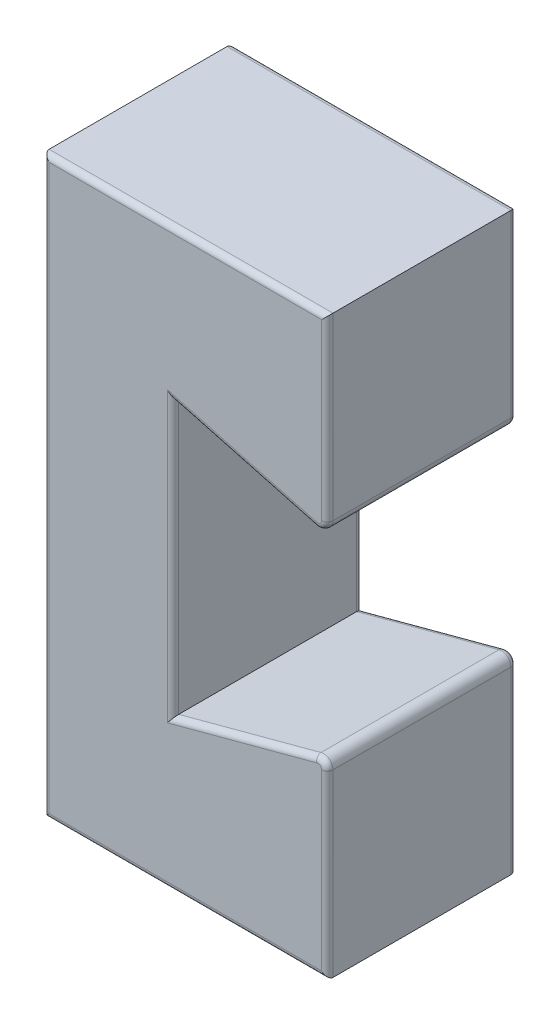
ISO-10303-21;
HEADER;
FILE_DESCRIPTION(('STEP AP214'),'2;1');
FILE_NAME('part.step','',(''),(''),'','','');
FILE_SCHEMA(('AUTOMOTIVE_DESIGN { 1 0 10303 214 1 1 1 1 }'));
ENDSEC;
DATA;
#1=APPLICATION_CONTEXT('core data for automotive mechanical design processes');
#2=APPLICATION_PROTOCOL_DEFINITION('international standard','automotive_design',2000,#1);
#3=PRODUCT_CONTEXT('',#1,'mechanical');
#4=PRODUCT('Part','Part','',(#3));
#5=PRODUCT_RELATED_PRODUCT_CATEGORY('part','',(#4));
#6=PRODUCT_DEFINITION_FORMATION('','',#4);
#7=PRODUCT_DEFINITION_CONTEXT('part definition',#1,'design');
#8=PRODUCT_DEFINITION('design','',#6,#7);
#9=PRODUCT_DEFINITION_SHAPE('','',#8);
#10=(LENGTH_UNIT() NAMED_UNIT(*) SI_UNIT(.MILLI.,.METRE.));
#11=(NAMED_UNIT(*) PLANE_ANGLE_UNIT() SI_UNIT($,.RADIAN.));
#12=(NAMED_UNIT(*) SI_UNIT($,.STERADIAN.) SOLID_ANGLE_UNIT());
#13=UNCERTAINTY_MEASURE_WITH_UNIT(LENGTH_MEASURE(1.E-05),#10,'distance_accuracy_value','');
#14=(GEOMETRIC_REPRESENTATION_CONTEXT(3) GLOBAL_UNCERTAINTY_ASSIGNED_CONTEXT((#13)) GLOBAL_UNIT_ASSIGNED_CONTEXT((#10,
#11,#12)) REPRESENTATION_CONTEXT('',''));
#15=CARTESIAN_POINT('',(0.,0.,0.));
#16=DIRECTION('',(0.,0.,1.));
#17=DIRECTION('',(1.,0.,0.));
#18=AXIS2_PLACEMENT_3D('',#15,#16,#17);
#19=CARTESIAN_POINT('',(0.,0.,10.));
#20=DIRECTION('',(0.,0.,-1.));
#21=DIRECTION('',(-1.,0.,0.));
#22=AXIS2_PLACEMENT_3D('',#19,#20,#21);
#23=PLANE('',#22);
#24=CARTESIAN_POINT('',(14.5,20.9016126864206,10.));
#25=DIRECTION('',(0.,0.,-1.));
#26=DIRECTION('',(-1.,0.,0.));
#27=AXIS2_PLACEMENT_3D('',#24,#25,#26);
#28=CIRCLE('',#27,0.2);
#29=CARTESIAN_POINT('',(14.7,20.9016126864206,10.));
#30=VERTEX_POINT('',#29);
#31=CARTESIAN_POINT('',(14.4482361909795,20.7084275211628,10.));
#32=VERTEX_POINT('',#31);
#33=EDGE_CURVE('E326',#30,#32,#28,.T.);
#34=ORIENTED_EDGE('',*,*,#33,.F.);
#35=DIRECTION('',(0.,1.,0.));
#36=VECTOR('',#35,1.);
#37=CARTESIAN_POINT('',(14.7,0.,10.));
#38=LINE('',#37,#36);
#39=CARTESIAN_POINT('',(14.7,30.1,10.));
#40=VERTEX_POINT('',#39);
#41=EDGE_CURVE('E281',#30,#40,#38,.T.);
#42=ORIENTED_EDGE('',*,*,#41,.T.);
#43=DIRECTION('',(-1.,0.,0.));
#44=VECTOR('',#43,1.);
#45=CARTESIAN_POINT('',(0.,30.1,10.));
#46=LINE('',#45,#44);
#47=CARTESIAN_POINT('',(0.3,30.1,10.));
#48=VERTEX_POINT('',#47);
#49=EDGE_CURVE('E283',#40,#48,#46,.T.);
#50=ORIENTED_EDGE('',*,*,#49,.T.);
#51=DIRECTION('',(0.,-1.,0.));
#52=VECTOR('',#51,1.);
#53=CARTESIAN_POINT('',(0.3,0.,10.));
#54=LINE('',#53,#52);
#55=CARTESIAN_POINT('',(0.3,0.3,10.));
#56=VERTEX_POINT('',#55);
#57=EDGE_CURVE('E269',#48,#56,#54,.T.);
#58=ORIENTED_EDGE('',*,*,#57,.T.);
#59=DIRECTION('',(1.,0.,0.));
#60=VECTOR('',#59,1.);
#61=CARTESIAN_POINT('',(0.,0.3,10.));
#62=LINE('',#61,#60);
#63=CARTESIAN_POINT('',(14.7,0.3,10.));
#64=VERTEX_POINT('',#63);
#65=EDGE_CURVE('E271',#56,#64,#62,.T.);
#66=ORIENTED_EDGE('',*,*,#65,.T.);
#67=DIRECTION('',(0.,1.,0.));
#68=VECTOR('',#67,1.);
#69=CARTESIAN_POINT('',(14.7,0.,10.));
#70=LINE('',#69,#68);
#71=CARTESIAN_POINT('',(14.7,9.4983873135794,10.));
#72=VERTEX_POINT('',#71);
#73=EDGE_CURVE('E210',#64,#72,#70,.T.);
#74=ORIENTED_EDGE('',*,*,#73,.T.);
#75=CARTESIAN_POINT('',(14.5,9.4983873135794,10.));
#76=DIRECTION('',(0.,0.,-1.));
#77=DIRECTION('',(-1.,0.,0.));
#78=AXIS2_PLACEMENT_3D('',#75,#76,#77);
#79=CIRCLE('',#78,0.2);
#80=CARTESIAN_POINT('',(14.4482361909795,9.69157247883722,10.));
#81=VERTEX_POINT('',#80);
#82=EDGE_CURVE('E323',#81,#72,#79,.T.);
#83=ORIENTED_EDGE('',*,*,#82,.F.);
#84=DIRECTION('',(-0.965925826289069,-0.258819045102518,0.));
#85=VECTOR('',#84,1.);
#86=CARTESIAN_POINT('',(-1.45504481485253,5.43030117631936,10.));
#87=LINE('',#86,#85);
#88=CARTESIAN_POINT('',(6.55,7.57524646983402,10.));
#89=VERTEX_POINT('',#88);
#90=EDGE_CURVE('E274',#81,#89,#87,.T.);
#91=ORIENTED_EDGE('',*,*,#90,.T.);
#92=DIRECTION('',(0.,1.,0.));
#93=VECTOR('',#92,1.);
#94=CARTESIAN_POINT('',(6.55,0.,10.));
#95=LINE('',#94,#93);
#96=CARTESIAN_POINT('',(6.55,22.824753530166,10.));
#97=VERTEX_POINT('',#96);
#98=EDGE_CURVE('E276',#89,#97,#95,.T.);
#99=ORIENTED_EDGE('',*,*,#98,.T.);
#100=DIRECTION('',(0.965925826289069,-0.258819045102518,0.));
#101=VECTOR('',#100,1.);
#102=CARTESIAN_POINT('',(6.14495518514739,22.9332849612042,10.));
#103=LINE('',#102,#101);
#104=EDGE_CURVE('E278',#97,#32,#103,.T.);
#105=ORIENTED_EDGE('',*,*,#104,.T.);
#106=EDGE_LOOP('',(#34,#42,#50,#58,#66,#74,#83,#91,#99,#105));
#107=FACE_BOUND('',#106,.T.);
#108=ADVANCED_FACE('F39',(#107),#23,.F.);
#109=CARTESIAN_POINT('',(0.,0.,0.));
#110=DIRECTION('',(0.,0.,-1.));
#111=DIRECTION('',(-1.,0.,0.));
#112=AXIS2_PLACEMENT_3D('',#109,#110,#111);
#113=PLANE('',#112);
#114=CARTESIAN_POINT('',(14.5,20.9016126864206,0.));
#115=DIRECTION('',(0.,0.,-1.));
#116=DIRECTION('',(-1.,0.,0.));
#117=AXIS2_PLACEMENT_3D('',#114,#115,#116);
#118=CIRCLE('',#117,0.2);
#119=CARTESIAN_POINT('',(14.4482361909795,20.7084275211628,0.));
#120=VERTEX_POINT('',#119);
#121=CARTESIAN_POINT('',(14.7,20.9016126864206,0.));
#122=VERTEX_POINT('',#121);
#123=EDGE_CURVE('E316',#120,#122,#118,.F.);
#124=ORIENTED_EDGE('',*,*,#123,.F.);
#125=DIRECTION('',(0.965925826289069,-0.258819045102518,0.));
#126=VECTOR('',#125,1.);
#127=CARTESIAN_POINT('',(6.92764571353075,22.7235636662003,0.));
#128=LINE('',#127,#126);
#129=CARTESIAN_POINT('',(6.55,22.824753530166,0.));
#130=VERTEX_POINT('',#129);
#131=EDGE_CURVE('E231',#120,#130,#128,.F.);
#132=ORIENTED_EDGE('',*,*,#131,.T.);
#133=DIRECTION('',(0.,1.,0.));
#134=VECTOR('',#133,1.);
#135=CARTESIAN_POINT('',(6.55,7.96621408168638,0.));
#136=LINE('',#135,#134);
#137=CARTESIAN_POINT('',(6.55,7.57524646983402,0.));
#138=VERTEX_POINT('',#137);
#139=EDGE_CURVE('E233',#130,#138,#136,.F.);
#140=ORIENTED_EDGE('',*,*,#139,.T.);
#141=DIRECTION('',(-0.965925826289069,-0.258819045102518,0.));
#142=VECTOR('',#141,1.);
#143=CARTESIAN_POINT('',(15.0776457135308,9.86022225211328,0.));
#144=LINE('',#143,#142);
#145=CARTESIAN_POINT('',(14.4482361909795,9.69157247883721,0.));
#146=VERTEX_POINT('',#145);
#147=EDGE_CURVE('E235',#138,#146,#144,.F.);
#148=ORIENTED_EDGE('',*,*,#147,.T.);
#149=CARTESIAN_POINT('',(14.5,9.4983873135794,0.));
#150=DIRECTION('',(0.,0.,-1.));
#151=DIRECTION('',(-1.,0.,0.));
#152=AXIS2_PLACEMENT_3D('',#149,#150,#151);
#153=CIRCLE('',#152,0.2);
#154=CARTESIAN_POINT('',(14.7,9.4983873135794,0.));
#155=VERTEX_POINT('',#154);
#156=EDGE_CURVE('E286',#155,#146,#153,.F.);
#157=ORIENTED_EDGE('',*,*,#156,.F.);
#158=DIRECTION('',(0.,1.,0.));
#159=VECTOR('',#158,1.);
#160=CARTESIAN_POINT('',(14.7,0.,0.));
#161=LINE('',#160,#159);
#162=CARTESIAN_POINT('',(14.7,0.3,0.));
#163=VERTEX_POINT('',#162);
#164=EDGE_CURVE('E238',#155,#163,#161,.F.);
#165=ORIENTED_EDGE('',*,*,#164,.T.);
#166=DIRECTION('',(1.,0.,0.));
#167=VECTOR('',#166,1.);
#168=CARTESIAN_POINT('',(0.,0.3,0.));
#169=LINE('',#168,#167);
#170=CARTESIAN_POINT('',(0.3,0.3,0.));
#171=VERTEX_POINT('',#170);
#172=EDGE_CURVE('E191',#163,#171,#169,.F.);
#173=ORIENTED_EDGE('',*,*,#172,.T.);
#174=DIRECTION('',(0.,-1.,0.));
#175=VECTOR('',#174,1.);
#176=CARTESIAN_POINT('',(0.3,30.4,0.));
#177=LINE('',#176,#175);
#178=CARTESIAN_POINT('',(0.3,30.1,0.));
#179=VERTEX_POINT('',#178);
#180=EDGE_CURVE('E221',#171,#179,#177,.F.);
#181=ORIENTED_EDGE('',*,*,#180,.T.);
#182=DIRECTION('',(-1.,0.,0.));
#183=VECTOR('',#182,1.);
#184=CARTESIAN_POINT('',(15.,30.1,0.));
#185=LINE('',#184,#183);
#186=CARTESIAN_POINT('',(14.7,30.1,0.));
#187=VERTEX_POINT('',#186);
#188=EDGE_CURVE('E226',#179,#187,#185,.F.);
#189=ORIENTED_EDGE('',*,*,#188,.T.);
#190=DIRECTION('',(0.,1.,0.));
#191=VECTOR('',#190,1.);
#192=CARTESIAN_POINT('',(14.7,20.25,0.));
#193=LINE('',#192,#191);
#194=EDGE_CURVE('E228',#187,#122,#193,.F.);
#195=ORIENTED_EDGE('',*,*,#194,.T.);
#196=EDGE_LOOP('',(#124,#132,#140,#148,#157,#165,#173,#181,#189,#195));
#197=FACE_BOUND('',#196,.T.);
#198=ADVANCED_FACE('F406',(#197),#113,.T.);
#199=CARTESIAN_POINT('',(0.,0.,10.));
#200=DIRECTION('',(1.,0.,0.));
#201=DIRECTION('',(0.,0.,-1.));
#202=AXIS2_PLACEMENT_3D('',#199,#200,#201);
#203=PLANE('',#202);
#204=DIRECTION('',(0.,0.,-1.));
#205=VECTOR('',#204,1.);
#206=CARTESIAN_POINT('',(0.,30.4,10.));
#207=LINE('',#206,#205);
#208=CARTESIAN_POINT('',(0.,30.4,9.7));
#209=VERTEX_POINT('',#208);
#210=CARTESIAN_POINT('',(0.,30.4,0.3));
#211=VERTEX_POINT('',#210);
#212=EDGE_CURVE('E304',#209,#211,#207,.T.);
#213=ORIENTED_EDGE('',*,*,#212,.T.);
#214=DIRECTION('',(0.,-1.,0.));
#215=VECTOR('',#214,1.);
#216=CARTESIAN_POINT('',(0.,0.,0.3));
#217=LINE('',#216,#215);
#218=CARTESIAN_POINT('',(0.,0.,0.3));
#219=VERTEX_POINT('',#218);
#220=EDGE_CURVE('E267',#211,#219,#217,.T.);
#221=ORIENTED_EDGE('',*,*,#220,.T.);
#222=DIRECTION('',(0.,0.,-1.));
#223=VECTOR('',#222,1.);
#224=CARTESIAN_POINT('',(0.,0.,10.));
#225=LINE('',#224,#223);
#226=CARTESIAN_POINT('',(0.,0.,9.7));
#227=VERTEX_POINT('',#226);
#228=EDGE_CURVE('E202',#227,#219,#225,.T.);
#229=ORIENTED_EDGE('',*,*,#228,.F.);
#230=DIRECTION('',(0.,-1.,0.));
#231=VECTOR('',#230,1.);
#232=CARTESIAN_POINT('',(0.,0.,9.7));
#233=LINE('',#232,#231);
#234=EDGE_CURVE('E265',#227,#209,#233,.F.);
#235=ORIENTED_EDGE('',*,*,#234,.T.);
#236=EDGE_LOOP('',(#213,#221,#229,#235));
#237=FACE_BOUND('',#236,.T.);
#238=ADVANCED_FACE('F370',(#237),#203,.F.);
#239=CARTESIAN_POINT('',(0.,0.,10.));
#240=DIRECTION('',(0.,1.,0.));
#241=DIRECTION('',(0.,0.,1.));
#242=AXIS2_PLACEMENT_3D('',#239,#240,#241);
#243=PLANE('',#242);
#244=ORIENTED_EDGE('',*,*,#228,.T.);
#245=DIRECTION('',(1.,0.,0.));
#246=VECTOR('',#245,1.);
#247=CARTESIAN_POINT('',(15.,0.,0.3));
#248=LINE('',#247,#246);
#249=CARTESIAN_POINT('',(15.,0.,0.3));
#250=VERTEX_POINT('',#249);
#251=EDGE_CURVE('E201',#219,#250,#248,.T.);
#252=ORIENTED_EDGE('',*,*,#251,.T.);
#253=DIRECTION('',(0.,0.,-1.));
#254=VECTOR('',#253,1.);
#255=CARTESIAN_POINT('',(15.,0.,10.));
#256=LINE('',#255,#254);
#257=CARTESIAN_POINT('',(15.,0.,9.7));
#258=VERTEX_POINT('',#257);
#259=EDGE_CURVE('E184',#258,#250,#256,.T.);
#260=ORIENTED_EDGE('',*,*,#259,.F.);
#261=DIRECTION('',(1.,0.,0.));
#262=VECTOR('',#261,1.);
#263=CARTESIAN_POINT('',(0.,0.,9.7));
#264=LINE('',#263,#262);
#265=EDGE_CURVE('E198',#258,#227,#264,.F.);
#266=ORIENTED_EDGE('',*,*,#265,.T.);
#267=EDGE_LOOP('',(#244,#252,#260,#266));
#268=FACE_BOUND('',#267,.T.);
#269=ADVANCED_FACE('F196',(#268),#243,.F.);
#270=CARTESIAN_POINT('',(15.,0.,10.));
#271=DIRECTION('',(-1.,0.,0.));
#272=DIRECTION('',(0.,0.,1.));
#273=AXIS2_PLACEMENT_3D('',#270,#271,#272);
#274=PLANE('',#273);
#275=DIRECTION('',(0.,1.,0.));
#276=VECTOR('',#275,1.);
#277=CARTESIAN_POINT('',(15.,10.15,0.3));
#278=LINE('',#277,#276);
#279=CARTESIAN_POINT('',(15.,9.4983873135794,0.3));
#280=VERTEX_POINT('',#279);
#281=EDGE_CURVE('E190',#250,#280,#278,.T.);
#282=ORIENTED_EDGE('',*,*,#281,.T.);
#283=DIRECTION('',(0.,0.,-1.));
#284=VECTOR('',#283,1.);
#285=CARTESIAN_POINT('',(15.,9.4983873135794,10.));
#286=LINE('',#285,#284);
#287=CARTESIAN_POINT('',(15.,9.4983873135794,9.7));
#288=VERTEX_POINT('',#287);
#289=EDGE_CURVE('E186',#280,#288,#286,.F.);
#290=ORIENTED_EDGE('',*,*,#289,.T.);
#291=DIRECTION('',(0.,1.,0.));
#292=VECTOR('',#291,1.);
#293=CARTESIAN_POINT('',(15.,0.,9.7));
#294=LINE('',#293,#292);
#295=EDGE_CURVE('E180',#288,#258,#294,.F.);
#296=ORIENTED_EDGE('',*,*,#295,.T.);
#297=ORIENTED_EDGE('',*,*,#259,.T.);
#298=EDGE_LOOP('',(#282,#290,#296,#297));
#299=FACE_BOUND('',#298,.T.);
#300=ADVANCED_FACE('F183',(#299),#274,.F.);
#301=CARTESIAN_POINT('',(6.85,7.96621408168638,10.));
#302=DIRECTION('',(0.258819045102518,-0.965925826289069,0.));
#303=DIRECTION('',(0.965925826289069,0.258819045102518,0.));
#304=AXIS2_PLACEMENT_3D('',#301,#302,#303);
#305=PLANE('',#304);
#306=DIRECTION('',(-0.965925826289069,-0.258819045102518,0.));
#307=VECTOR('',#306,1.);
#308=CARTESIAN_POINT('',(6.85,7.96621408168638,9.7));
#309=LINE('',#308,#307);
#310=CARTESIAN_POINT('',(6.85,7.96621408168638,9.7));
#311=VERTEX_POINT('',#310);
#312=CARTESIAN_POINT('',(14.3705904774487,9.98135022672393,9.7));
#313=VERTEX_POINT('',#312);
#314=EDGE_CURVE('E243',#311,#313,#309,.F.);
#315=ORIENTED_EDGE('',*,*,#314,.T.);
#316=DIRECTION('',(0.,0.,-1.));
#317=VECTOR('',#316,1.);
#318=CARTESIAN_POINT('',(14.3705904774487,9.98135022672393,10.));
#319=LINE('',#318,#317);
#320=CARTESIAN_POINT('',(14.3705904774487,9.98135022672393,0.3));
#321=VERTEX_POINT('',#320);
#322=EDGE_CURVE('E340',#313,#321,#319,.T.);
#323=ORIENTED_EDGE('',*,*,#322,.T.);
#324=DIRECTION('',(-0.965925826289069,-0.258819045102518,0.));
#325=VECTOR('',#324,1.);
#326=CARTESIAN_POINT('',(6.85,7.96621408168638,0.3));
#327=LINE('',#326,#325);
#328=CARTESIAN_POINT('',(6.85,7.96621408168638,0.3));
#329=VERTEX_POINT('',#328);
#330=EDGE_CURVE('E246',#321,#329,#327,.T.);
#331=ORIENTED_EDGE('',*,*,#330,.T.);
#332=DIRECTION('',(0.,0.,-1.));
#333=VECTOR('',#332,1.);
#334=CARTESIAN_POINT('',(6.85,7.96621408168638,10.));
#335=LINE('',#334,#333);
#336=EDGE_CURVE('E203',#311,#329,#335,.T.);
#337=ORIENTED_EDGE('',*,*,#336,.F.);
#338=EDGE_LOOP('',(#315,#323,#331,#337));
#339=FACE_BOUND('',#338,.T.);
#340=ADVANCED_FACE('F469',(#339),#305,.F.);
#341=CARTESIAN_POINT('',(6.85,22.4337859183136,10.));
#342=DIRECTION('',(-1.,0.,0.));
#343=DIRECTION('',(0.,-1.,0.));
#344=AXIS2_PLACEMENT_3D('',#341,#342,#343);
#345=PLANE('',#344);
#346=ORIENTED_EDGE('',*,*,#336,.T.);
#347=DIRECTION('',(0.,1.,0.));
#348=VECTOR('',#347,1.);
#349=CARTESIAN_POINT('',(6.85,22.4337859183136,0.3));
#350=LINE('',#349,#348);
#351=CARTESIAN_POINT('',(6.85,22.4337859183136,0.3));
#352=VERTEX_POINT('',#351);
#353=EDGE_CURVE('E250',#329,#352,#350,.T.);
#354=ORIENTED_EDGE('',*,*,#353,.T.);
#355=DIRECTION('',(0.,0.,-1.));
#356=VECTOR('',#355,1.);
#357=CARTESIAN_POINT('',(6.85,22.4337859183136,10.));
#358=LINE('',#357,#356);
#359=CARTESIAN_POINT('',(6.85,22.4337859183136,9.7));
#360=VERTEX_POINT('',#359);
#361=EDGE_CURVE('E439',#360,#352,#358,.T.);
#362=ORIENTED_EDGE('',*,*,#361,.F.);
#363=DIRECTION('',(0.,1.,0.));
#364=VECTOR('',#363,1.);
#365=CARTESIAN_POINT('',(6.85,22.4337859183136,9.7));
#366=LINE('',#365,#364);
#367=EDGE_CURVE('E248',#360,#311,#366,.F.);
#368=ORIENTED_EDGE('',*,*,#367,.T.);
#369=EDGE_LOOP('',(#346,#354,#362,#368));
#370=FACE_BOUND('',#369,.T.);
#371=ADVANCED_FACE('F438',(#370),#345,.F.);
#372=CARTESIAN_POINT('',(15.,20.25,10.));
#373=DIRECTION('',(0.258819045102518,0.965925826289069,0.));
#374=DIRECTION('',(-0.965925826289069,0.258819045102518,0.));
#375=AXIS2_PLACEMENT_3D('',#372,#373,#374);
#376=PLANE('',#375);
#377=DIRECTION('',(0.965925826289069,-0.258819045102518,0.));
#378=VECTOR('',#377,1.);
#379=CARTESIAN_POINT('',(15.,20.25,0.3));
#380=LINE('',#379,#378);
#381=CARTESIAN_POINT('',(14.3705904774487,20.4186497732761,0.3));
#382=VERTEX_POINT('',#381);
#383=EDGE_CURVE('E254',#352,#382,#380,.T.);
#384=ORIENTED_EDGE('',*,*,#383,.T.);
#385=DIRECTION('',(0.,0.,-1.));
#386=VECTOR('',#385,1.);
#387=CARTESIAN_POINT('',(14.3705904774487,20.4186497732761,10.));
#388=LINE('',#387,#386);
#389=CARTESIAN_POINT('',(14.3705904774487,20.4186497732761,9.7));
#390=VERTEX_POINT('',#389);
#391=EDGE_CURVE('E11',#382,#390,#388,.F.);
#392=ORIENTED_EDGE('',*,*,#391,.T.);
#393=DIRECTION('',(0.965925826289069,-0.258819045102518,0.));
#394=VECTOR('',#393,1.);
#395=CARTESIAN_POINT('',(15.,20.25,9.7));
#396=LINE('',#395,#394);
#397=EDGE_CURVE('E252',#390,#360,#396,.F.);
#398=ORIENTED_EDGE('',*,*,#397,.T.);
#399=ORIENTED_EDGE('',*,*,#361,.T.);
#400=EDGE_LOOP('',(#384,#392,#398,#399));
#401=FACE_BOUND('',#400,.T.);
#402=ADVANCED_FACE('F443',(#401),#376,.F.);
#403=CARTESIAN_POINT('',(15.,20.25,10.));
#404=DIRECTION('',(-1.,0.,0.));
#405=DIRECTION('',(0.,0.,1.));
#406=AXIS2_PLACEMENT_3D('',#403,#404,#405);
#407=PLANE('',#406);
#408=DIRECTION('',(0.,1.,0.));
#409=VECTOR('',#408,1.);
#410=CARTESIAN_POINT('',(15.,20.25,9.7));
#411=LINE('',#410,#409);
#412=CARTESIAN_POINT('',(15.,30.4,9.7));
#413=VERTEX_POINT('',#412);
#414=CARTESIAN_POINT('',(15.,20.9016126864206,9.7));
#415=VERTEX_POINT('',#414);
#416=EDGE_CURVE('E256',#413,#415,#411,.F.);
#417=ORIENTED_EDGE('',*,*,#416,.T.);
#418=DIRECTION('',(0.,0.,-1.));
#419=VECTOR('',#418,1.);
#420=CARTESIAN_POINT('',(15.,20.9016126864206,10.));
#421=LINE('',#420,#419);
#422=CARTESIAN_POINT('',(15.,20.9016126864206,0.3));
#423=VERTEX_POINT('',#422);
#424=EDGE_CURVE('E48',#415,#423,#421,.T.);
#425=ORIENTED_EDGE('',*,*,#424,.T.);
#426=DIRECTION('',(0.,1.,0.));
#427=VECTOR('',#426,1.);
#428=CARTESIAN_POINT('',(15.,30.4,0.3));
#429=LINE('',#428,#427);
#430=CARTESIAN_POINT('',(15.,30.4,0.3));
#431=VERTEX_POINT('',#430);
#432=EDGE_CURVE('E258',#423,#431,#429,.T.);
#433=ORIENTED_EDGE('',*,*,#432,.T.);
#434=DIRECTION('',(0.,0.,-1.));
#435=VECTOR('',#434,1.);
#436=CARTESIAN_POINT('',(15.,30.4,10.));
#437=LINE('',#436,#435);
#438=EDGE_CURVE('E378',#413,#431,#437,.T.);
#439=ORIENTED_EDGE('',*,*,#438,.F.);
#440=EDGE_LOOP('',(#417,#425,#433,#439));
#441=FACE_BOUND('',#440,.T.);
#442=ADVANCED_FACE('F387',(#441),#407,.F.);
#443=CARTESIAN_POINT('',(0.,30.4,10.));
#444=DIRECTION('',(0.,-1.,0.));
#445=DIRECTION('',(0.,0.,-1.));
#446=AXIS2_PLACEMENT_3D('',#443,#444,#445);
#447=PLANE('',#446);
#448=ORIENTED_EDGE('',*,*,#438,.T.);
#449=DIRECTION('',(-1.,0.,0.));
#450=VECTOR('',#449,1.);
#451=CARTESIAN_POINT('',(0.,30.4,0.3));
#452=LINE('',#451,#450);
#453=EDGE_CURVE('E263',#431,#211,#452,.T.);
#454=ORIENTED_EDGE('',*,*,#453,.T.);
#455=ORIENTED_EDGE('',*,*,#212,.F.);
#456=DIRECTION('',(-1.,0.,0.));
#457=VECTOR('',#456,1.);
#458=CARTESIAN_POINT('',(0.,30.4,9.7));
#459=LINE('',#458,#457);
#460=EDGE_CURVE('E260',#209,#413,#459,.F.);
#461=ORIENTED_EDGE('',*,*,#460,.T.);
#462=EDGE_LOOP('',(#448,#454,#455,#461));
#463=FACE_BOUND('',#462,.T.);
#464=ADVANCED_FACE('F375',(#463),#447,.F.);
#465=CARTESIAN_POINT('',(15.0776457135308,20.5397777478867,0.3));
#466=DIRECTION('',(-0.965925826289069,0.258819045102518,0.));
#467=DIRECTION('',(-0.258819045102518,-0.965925826289069,0.));
#468=AXIS2_PLACEMENT_3D('',#465,#466,#467);
#469=CYLINDRICAL_SURFACE('',#468,0.3);
#470=ORIENTED_EDGE('',*,*,#131,.F.);
#471=CARTESIAN_POINT('',(14.4482361909795,20.7084275211628,0.3));
#472=DIRECTION('',(-0.965925826289069,0.258819045102517,0.));
#473=DIRECTION('',(-0.258819045102517,-0.965925826289069,0.));
#474=AXIS2_PLACEMENT_3D('',#471,#472,#473);
#475=CIRCLE('',#474,0.3);
#476=EDGE_CURVE('E56',#120,#382,#475,.T.);
#477=ORIENTED_EDGE('',*,*,#476,.T.);
#478=ORIENTED_EDGE('',*,*,#383,.F.);
#479=CARTESIAN_POINT('',(6.55,22.824753530166,0.3));
#480=DIRECTION('',(-0.793353340291234,-0.608761429008722,0.));
#481=DIRECTION('',(0.608761429008722,-0.793353340291234,0.));
#482=AXIS2_PLACEMENT_3D('',#479,#480,#481);
#483=ELLIPSE('',#482,0.492803889511373,0.3);
#484=EDGE_CURVE('E301',#130,#352,#483,.T.);
#485=ORIENTED_EDGE('',*,*,#484,.F.);
#486=EDGE_LOOP('',(#470,#477,#478,#485));
#487=FACE_BOUND('',#486,.T.);
#488=ADVANCED_FACE('F446',(#487),#469,.T.);
#489=CARTESIAN_POINT('',(14.7,20.25,0.3));
#490=DIRECTION('',(0.,-1.,0.));
#491=DIRECTION('',(0.,0.,-1.));
#492=AXIS2_PLACEMENT_3D('',#489,#490,#491);
#493=CYLINDRICAL_SURFACE('',#492,0.3);
#494=ORIENTED_EDGE('',*,*,#432,.F.);
#495=CARTESIAN_POINT('',(14.7,20.9016126864206,0.3));
#496=DIRECTION('',(0.,1.,0.));
#497=DIRECTION('',(0.,0.,1.));
#498=AXIS2_PLACEMENT_3D('',#495,#496,#497);
#499=CIRCLE('',#498,0.3);
#500=EDGE_CURVE('E319',#423,#122,#499,.T.);
#501=ORIENTED_EDGE('',*,*,#500,.T.);
#502=ORIENTED_EDGE('',*,*,#194,.F.);
#503=CARTESIAN_POINT('',(14.7,30.1,0.3));
#504=DIRECTION('',(0.707106781186547,-0.707106781186547,0.));
#505=DIRECTION('',(0.707106781186547,0.707106781186547,0.));
#506=AXIS2_PLACEMENT_3D('',#503,#504,#505);
#507=ELLIPSE('',#506,0.424264068711928,0.3);
#508=EDGE_CURVE('E298',#431,#187,#507,.F.);
#509=ORIENTED_EDGE('',*,*,#508,.F.);
#510=EDGE_LOOP('',(#494,#501,#502,#509));
#511=FACE_BOUND('',#510,.T.);
#512=ADVANCED_FACE('F403',(#511),#493,.T.);
#513=CARTESIAN_POINT('',(6.55,22.4337859183136,0.3));
#514=DIRECTION('',(0.,-1.,0.));
#515=DIRECTION('',(1.,0.,0.));
#516=AXIS2_PLACEMENT_3D('',#513,#514,#515);
#517=CYLINDRICAL_SURFACE('',#516,0.3);
#518=ORIENTED_EDGE('',*,*,#484,.T.);
#519=ORIENTED_EDGE('',*,*,#353,.F.);
#520=CARTESIAN_POINT('',(6.55,7.57524646983402,0.3));
#521=DIRECTION('',(0.793353340291234,-0.608761429008722,0.));
#522=DIRECTION('',(0.608761429008722,0.793353340291234,0.));
#523=AXIS2_PLACEMENT_3D('',#520,#521,#522);
#524=ELLIPSE('',#523,0.492803889511373,0.3);
#525=EDGE_CURVE('E295',#138,#329,#524,.T.);
#526=ORIENTED_EDGE('',*,*,#525,.F.);
#527=ORIENTED_EDGE('',*,*,#139,.F.);
#528=EDGE_LOOP('',(#518,#519,#526,#527));
#529=FACE_BOUND('',#528,.T.);
#530=ADVANCED_FACE('F433',(#529),#517,.T.);
#531=CARTESIAN_POINT('',(0.,30.1,0.3));
#532=DIRECTION('',(1.,0.,0.));
#533=DIRECTION('',(0.,0.,-1.));
#534=AXIS2_PLACEMENT_3D('',#531,#532,#533);
#535=CYLINDRICAL_SURFACE('',#534,0.3);
#536=ORIENTED_EDGE('',*,*,#508,.T.);
#537=ORIENTED_EDGE('',*,*,#188,.F.);
#538=CARTESIAN_POINT('',(0.3,30.1,0.3));
#539=DIRECTION('',(0.707106781186547,0.707106781186547,0.));
#540=DIRECTION('',(-0.707106781186547,0.707106781186547,0.));
#541=AXIS2_PLACEMENT_3D('',#538,#539,#540);
#542=ELLIPSE('',#541,0.424264068711928,0.3);
#543=EDGE_CURVE('E292',#211,#179,#542,.F.);
#544=ORIENTED_EDGE('',*,*,#543,.F.);
#545=ORIENTED_EDGE('',*,*,#453,.F.);
#546=EDGE_LOOP('',(#536,#537,#544,#545));
#547=FACE_BOUND('',#546,.T.);
#548=ADVANCED_FACE('F410',(#547),#535,.T.);
#549=CARTESIAN_POINT('',(6.92764571353076,7.67643633379966,0.3));
#550=DIRECTION('',(0.965925826289069,0.258819045102518,0.));
#551=DIRECTION('',(-0.258819045102518,0.965925826289069,0.));
#552=AXIS2_PLACEMENT_3D('',#549,#550,#551);
#553=CYLINDRICAL_SURFACE('',#552,0.3);
#554=ORIENTED_EDGE('',*,*,#330,.F.);
#555=CARTESIAN_POINT('',(14.4482361909795,9.69157247883721,0.3));
#556=DIRECTION('',(-0.96592582628907,-0.258819045102516,0.));
#557=DIRECTION('',(0.258819045102516,-0.96592582628907,0.));
#558=AXIS2_PLACEMENT_3D('',#555,#556,#557);
#559=CIRCLE('',#558,0.3);
#560=EDGE_CURVE('E329',#321,#146,#559,.T.);
#561=ORIENTED_EDGE('',*,*,#560,.T.);
#562=ORIENTED_EDGE('',*,*,#147,.F.);
#563=ORIENTED_EDGE('',*,*,#525,.T.);
#564=EDGE_LOOP('',(#554,#561,#562,#563));
#565=FACE_BOUND('',#564,.T.);
#566=ADVANCED_FACE('F427',(#565),#553,.T.);
#567=CARTESIAN_POINT('',(0.3,0.,0.3));
#568=DIRECTION('',(0.,1.,0.));
#569=DIRECTION('',(0.,0.,1.));
#570=AXIS2_PLACEMENT_3D('',#567,#568,#569);
#571=CYLINDRICAL_SURFACE('',#570,0.3);
#572=ORIENTED_EDGE('',*,*,#543,.T.);
#573=ORIENTED_EDGE('',*,*,#180,.F.);
#574=CARTESIAN_POINT('',(0.3,0.3,0.3));
#575=DIRECTION('',(-0.707106781186547,0.707106781186547,0.));
#576=DIRECTION('',(0.707106781186547,0.707106781186547,0.));
#577=AXIS2_PLACEMENT_3D('',#574,#575,#576);
#578=ELLIPSE('',#577,0.424264068711928,0.3);
#579=EDGE_CURVE('E289',#219,#171,#578,.F.);
#580=ORIENTED_EDGE('',*,*,#579,.F.);
#581=ORIENTED_EDGE('',*,*,#220,.F.);
#582=EDGE_LOOP('',(#572,#573,#580,#581));
#583=FACE_BOUND('',#582,.T.);
#584=ADVANCED_FACE('F413',(#583),#571,.T.);
#585=CARTESIAN_POINT('',(14.7,0.,0.3));
#586=DIRECTION('',(0.,-1.,0.));
#587=DIRECTION('',(0.,0.,-1.));
#588=AXIS2_PLACEMENT_3D('',#585,#586,#587);
#589=CYLINDRICAL_SURFACE('',#588,0.3);
#590=ORIENTED_EDGE('',*,*,#164,.F.);
#591=CARTESIAN_POINT('',(14.7,9.4983873135794,0.3));
#592=DIRECTION('',(0.,-1.,0.));
#593=DIRECTION('',(0.,0.,-1.));
#594=AXIS2_PLACEMENT_3D('',#591,#592,#593);
#595=CIRCLE('',#594,0.3);
#596=EDGE_CURVE('E336',#155,#280,#595,.T.);
#597=ORIENTED_EDGE('',*,*,#596,.T.);
#598=ORIENTED_EDGE('',*,*,#281,.F.);
#599=CARTESIAN_POINT('',(14.7,0.3,0.3));
#600=DIRECTION('',(-0.707106781186547,-0.707106781186547,0.));
#601=DIRECTION('',(0.707106781186547,-0.707106781186547,0.));
#602=AXIS2_PLACEMENT_3D('',#599,#600,#601);
#603=ELLIPSE('',#602,0.424264068711928,0.3);
#604=EDGE_CURVE('E287',#163,#250,#603,.T.);
#605=ORIENTED_EDGE('',*,*,#604,.F.);
#606=EDGE_LOOP('',(#590,#597,#598,#605));
#607=FACE_BOUND('',#606,.T.);
#608=ADVANCED_FACE('F422',(#607),#589,.T.);
#609=CARTESIAN_POINT('',(0.,0.3,0.3));
#610=DIRECTION('',(-1.,0.,0.));
#611=DIRECTION('',(0.,0.,1.));
#612=AXIS2_PLACEMENT_3D('',#609,#610,#611);
#613=CYLINDRICAL_SURFACE('',#612,0.3);
#614=ORIENTED_EDGE('',*,*,#579,.T.);
#615=ORIENTED_EDGE('',*,*,#172,.F.);
#616=ORIENTED_EDGE('',*,*,#604,.T.);
#617=ORIENTED_EDGE('',*,*,#251,.F.);
#618=EDGE_LOOP('',(#614,#615,#616,#617));
#619=FACE_BOUND('',#618,.T.);
#620=ADVANCED_FACE('F417',(#619),#613,.T.);
#621=CARTESIAN_POINT('',(-1.45504481485253,5.43030117631936,9.7));
#622=DIRECTION('',(-0.965925826289069,-0.258819045102518,0.));
#623=DIRECTION('',(0.258819045102518,-0.965925826289069,0.));
#624=AXIS2_PLACEMENT_3D('',#621,#622,#623);
#625=CYLINDRICAL_SURFACE('',#624,0.3);
#626=ORIENTED_EDGE('',*,*,#90,.F.);
#627=CARTESIAN_POINT('',(14.4482361909795,9.69157247883721,9.7));
#628=DIRECTION('',(-0.96592582628907,-0.258819045102516,0.));
#629=DIRECTION('',(0.258819045102516,-0.96592582628907,0.));
#630=AXIS2_PLACEMENT_3D('',#627,#628,#629);
#631=CIRCLE('',#630,0.3);
#632=EDGE_CURVE('E334',#81,#313,#631,.T.);
#633=ORIENTED_EDGE('',*,*,#632,.T.);
#634=ORIENTED_EDGE('',*,*,#314,.F.);
#635=CARTESIAN_POINT('',(6.55,7.57524646983402,9.7));
#636=DIRECTION('',(-0.793353340291234,0.608761429008722,0.));
#637=DIRECTION('',(0.608761429008722,0.793353340291234,0.));
#638=AXIS2_PLACEMENT_3D('',#635,#636,#637);
#639=ELLIPSE('',#638,0.492803889511373,0.3);
#640=EDGE_CURVE('E290',#89,#311,#639,.T.);
#641=ORIENTED_EDGE('',*,*,#640,.F.);
#642=EDGE_LOOP('',(#626,#633,#634,#641));
#643=FACE_BOUND('',#642,.T.);
#644=ADVANCED_FACE('F481',(#643),#625,.T.);
#645=CARTESIAN_POINT('',(6.55,0.,9.7));
#646=DIRECTION('',(0.,1.,0.));
#647=DIRECTION('',(-1.,0.,0.));
#648=AXIS2_PLACEMENT_3D('',#645,#646,#647);
#649=CYLINDRICAL_SURFACE('',#648,0.3);
#650=ORIENTED_EDGE('',*,*,#640,.T.);
#651=ORIENTED_EDGE('',*,*,#367,.F.);
#652=CARTESIAN_POINT('',(6.55,22.824753530166,9.7));
#653=DIRECTION('',(0.793353340291234,0.608761429008722,0.));
#654=DIRECTION('',(0.608761429008722,-0.793353340291234,0.));
#655=AXIS2_PLACEMENT_3D('',#652,#653,#654);
#656=ELLIPSE('',#655,0.492803889511373,0.3);
#657=EDGE_CURVE('E213',#97,#360,#656,.T.);
#658=ORIENTED_EDGE('',*,*,#657,.F.);
#659=ORIENTED_EDGE('',*,*,#98,.F.);
#660=EDGE_LOOP('',(#650,#651,#658,#659));
#661=FACE_BOUND('',#660,.T.);
#662=ADVANCED_FACE('F523',(#661),#649,.T.);
#663=CARTESIAN_POINT('',(14.7,0.,9.7));
#664=DIRECTION('',(0.,1.,0.));
#665=DIRECTION('',(0.,0.,1.));
#666=AXIS2_PLACEMENT_3D('',#663,#664,#665);
#667=CYLINDRICAL_SURFACE('',#666,0.3);
#668=ORIENTED_EDGE('',*,*,#295,.F.);
#669=CARTESIAN_POINT('',(14.7,9.4983873135794,9.7));
#670=DIRECTION('',(0.,-1.,0.));
#671=DIRECTION('',(0.,0.,-1.));
#672=AXIS2_PLACEMENT_3D('',#669,#670,#671);
#673=CIRCLE('',#672,0.3);
#674=EDGE_CURVE('E332',#288,#72,#673,.T.);
#675=ORIENTED_EDGE('',*,*,#674,.T.);
#676=ORIENTED_EDGE('',*,*,#73,.F.);
#677=CARTESIAN_POINT('',(14.7,0.3,9.7));
#678=DIRECTION('',(0.707106781186547,0.707106781186547,0.));
#679=DIRECTION('',(0.707106781186547,-0.707106781186547,0.));
#680=AXIS2_PLACEMENT_3D('',#677,#678,#679);
#681=ELLIPSE('',#680,0.424264068711928,0.3);
#682=EDGE_CURVE('E207',#258,#64,#681,.F.);
#683=ORIENTED_EDGE('',*,*,#682,.F.);
#684=EDGE_LOOP('',(#668,#675,#676,#683));
#685=FACE_BOUND('',#684,.T.);
#686=ADVANCED_FACE('F208',(#685),#667,.T.);
#687=CARTESIAN_POINT('',(6.14495518514739,22.9332849612042,9.7));
#688=DIRECTION('',(0.965925826289069,-0.258819045102518,0.));
#689=DIRECTION('',(0.258819045102518,0.965925826289069,0.));
#690=AXIS2_PLACEMENT_3D('',#687,#688,#689);
#691=CYLINDRICAL_SURFACE('',#690,0.3);
#692=ORIENTED_EDGE('',*,*,#397,.F.);
#693=CARTESIAN_POINT('',(14.4482361909795,20.7084275211628,9.7));
#694=DIRECTION('',(-0.965925826289069,0.258819045102517,0.));
#695=DIRECTION('',(-0.258819045102517,-0.965925826289069,0.));
#696=AXIS2_PLACEMENT_3D('',#693,#694,#695);
#697=CIRCLE('',#696,0.3);
#698=EDGE_CURVE('E321',#390,#32,#697,.T.);
#699=ORIENTED_EDGE('',*,*,#698,.T.);
#700=ORIENTED_EDGE('',*,*,#104,.F.);
#701=ORIENTED_EDGE('',*,*,#657,.T.);
#702=EDGE_LOOP('',(#692,#699,#700,#701));
#703=FACE_BOUND('',#702,.T.);
#704=ADVANCED_FACE('F538',(#703),#691,.T.);
#705=CARTESIAN_POINT('',(0.,0.3,9.7));
#706=DIRECTION('',(1.,0.,0.));
#707=DIRECTION('',(0.,0.,-1.));
#708=AXIS2_PLACEMENT_3D('',#705,#706,#707);
#709=CYLINDRICAL_SURFACE('',#708,0.3);
#710=ORIENTED_EDGE('',*,*,#682,.T.);
#711=ORIENTED_EDGE('',*,*,#65,.F.);
#712=CARTESIAN_POINT('',(0.3,0.3,9.7));
#713=DIRECTION('',(0.707106781186547,-0.707106781186547,0.));
#714=DIRECTION('',(-0.707106781186547,-0.707106781186547,0.));
#715=AXIS2_PLACEMENT_3D('',#712,#713,#714);
#716=ELLIPSE('',#715,0.424264068711928,0.3);
#717=EDGE_CURVE('E214',#227,#56,#716,.F.);
#718=ORIENTED_EDGE('',*,*,#717,.F.);
#719=ORIENTED_EDGE('',*,*,#265,.F.);
#720=EDGE_LOOP('',(#710,#711,#718,#719));
#721=FACE_BOUND('',#720,.T.);
#722=ADVANCED_FACE('F217',(#721),#709,.T.);
#723=CARTESIAN_POINT('',(14.7,0.,9.7));
#724=DIRECTION('',(0.,1.,0.));
#725=DIRECTION('',(0.,0.,1.));
#726=AXIS2_PLACEMENT_3D('',#723,#724,#725);
#727=CYLINDRICAL_SURFACE('',#726,0.3);
#728=ORIENTED_EDGE('',*,*,#41,.F.);
#729=CARTESIAN_POINT('',(14.7,20.9016126864206,9.7));
#730=DIRECTION('',(0.,1.,0.));
#731=DIRECTION('',(0.,0.,1.));
#732=AXIS2_PLACEMENT_3D('',#729,#730,#731);
#733=CIRCLE('',#732,0.3);
#734=EDGE_CURVE('E64',#30,#415,#733,.T.);
#735=ORIENTED_EDGE('',*,*,#734,.T.);
#736=ORIENTED_EDGE('',*,*,#416,.F.);
#737=CARTESIAN_POINT('',(14.7,30.1,9.7));
#738=DIRECTION('',(-0.707106781186547,0.707106781186547,0.));
#739=DIRECTION('',(0.707106781186547,0.707106781186547,0.));
#740=AXIS2_PLACEMENT_3D('',#737,#738,#739);
#741=ELLIPSE('',#740,0.424264068711928,0.3);
#742=EDGE_CURVE('E307',#40,#413,#741,.T.);
#743=ORIENTED_EDGE('',*,*,#742,.F.);
#744=EDGE_LOOP('',(#728,#735,#736,#743));
#745=FACE_BOUND('',#744,.T.);
#746=ADVANCED_FACE('F384',(#745),#727,.T.);
#747=CARTESIAN_POINT('',(0.3,0.,9.7));
#748=DIRECTION('',(0.,-1.,0.));
#749=DIRECTION('',(0.,0.,-1.));
#750=AXIS2_PLACEMENT_3D('',#747,#748,#749);
#751=CYLINDRICAL_SURFACE('',#750,0.3);
#752=ORIENTED_EDGE('',*,*,#717,.T.);
#753=ORIENTED_EDGE('',*,*,#57,.F.);
#754=CARTESIAN_POINT('',(0.3,30.1,9.7));
#755=DIRECTION('',(-0.707106781186547,-0.707106781186547,0.));
#756=DIRECTION('',(0.707106781186547,-0.707106781186547,0.));
#757=AXIS2_PLACEMENT_3D('',#754,#755,#756);
#758=ELLIPSE('',#757,0.424264068711928,0.3);
#759=EDGE_CURVE('E305',#209,#48,#758,.F.);
#760=ORIENTED_EDGE('',*,*,#759,.F.);
#761=ORIENTED_EDGE('',*,*,#234,.F.);
#762=EDGE_LOOP('',(#752,#753,#760,#761));
#763=FACE_BOUND('',#762,.T.);
#764=ADVANCED_FACE('F365',(#763),#751,.T.);
#765=CARTESIAN_POINT('',(0.,30.1,9.7));
#766=DIRECTION('',(-1.,0.,0.));
#767=DIRECTION('',(0.,0.,1.));
#768=AXIS2_PLACEMENT_3D('',#765,#766,#767);
#769=CYLINDRICAL_SURFACE('',#768,0.3);
#770=ORIENTED_EDGE('',*,*,#742,.T.);
#771=ORIENTED_EDGE('',*,*,#460,.F.);
#772=ORIENTED_EDGE('',*,*,#759,.T.);
#773=ORIENTED_EDGE('',*,*,#49,.F.);
#774=EDGE_LOOP('',(#770,#771,#772,#773));
#775=FACE_BOUND('',#774,.T.);
#776=ADVANCED_FACE('F381',(#775),#769,.T.);
#777=CARTESIAN_POINT('',(14.5,20.9016126864206,9.7));
#778=DIRECTION('',(0.,0.,-1.));
#779=DIRECTION('',(-1.,0.,0.));
#780=AXIS2_PLACEMENT_3D('',#777,#778,#779);
#781=DEGENERATE_TOROIDAL_SURFACE('',#780,0.2,0.3,.T.);
#782=ORIENTED_EDGE('',*,*,#33,.T.);
#783=ORIENTED_EDGE('',*,*,#698,.F.);
#784=CARTESIAN_POINT('',(14.5,20.9016126864206,9.7));
#785=DIRECTION('',(0.,0.,-1.));
#786=DIRECTION('',(-1.,0.,0.));
#787=AXIS2_PLACEMENT_3D('',#784,#785,#786);
#788=CIRCLE('',#787,0.5);
#789=EDGE_CURVE('E308',#415,#390,#788,.T.);
#790=ORIENTED_EDGE('',*,*,#789,.F.);
#791=ORIENTED_EDGE('',*,*,#734,.F.);
#792=EDGE_LOOP('',(#782,#783,#790,#791));
#793=FACE_BOUND('',#792,.T.);
#794=ADVANCED_FACE('F392',(#793),#781,.T.);
#795=CARTESIAN_POINT('',(14.5,20.9016126864206,10.));
#796=DIRECTION('',(0.,0.,-1.));
#797=DIRECTION('',(-1.,0.,0.));
#798=AXIS2_PLACEMENT_3D('',#795,#796,#797);
#799=CYLINDRICAL_SURFACE('',#798,0.5);
#800=ORIENTED_EDGE('',*,*,#789,.T.);
#801=ORIENTED_EDGE('',*,*,#391,.F.);
#802=CARTESIAN_POINT('',(14.5,20.9016126864206,0.3));
#803=DIRECTION('',(0.,0.,-1.));
#804=DIRECTION('',(-1.,0.,0.));
#805=AXIS2_PLACEMENT_3D('',#802,#803,#804);
#806=CIRCLE('',#805,0.5);
#807=EDGE_CURVE('E344',#423,#382,#806,.T.);
#808=ORIENTED_EDGE('',*,*,#807,.F.);
#809=ORIENTED_EDGE('',*,*,#424,.F.);
#810=EDGE_LOOP('',(#800,#801,#808,#809));
#811=FACE_BOUND('',#810,.T.);
#812=ADVANCED_FACE('F396',(#811),#799,.T.);
#813=CARTESIAN_POINT('',(14.5,20.9016126864206,0.3));
#814=DIRECTION('',(0.,0.,-1.));
#815=DIRECTION('',(-1.,0.,0.));
#816=AXIS2_PLACEMENT_3D('',#813,#814,#815);
#817=DEGENERATE_TOROIDAL_SURFACE('',#816,0.2,0.3,.T.);
#818=ORIENTED_EDGE('',*,*,#476,.F.);
#819=ORIENTED_EDGE('',*,*,#123,.T.);
#820=ORIENTED_EDGE('',*,*,#500,.F.);
#821=ORIENTED_EDGE('',*,*,#807,.T.);
#822=EDGE_LOOP('',(#818,#819,#820,#821));
#823=FACE_BOUND('',#822,.T.);
#824=ADVANCED_FACE('F399',(#823),#817,.T.);
#825=CARTESIAN_POINT('',(14.5,9.4983873135794,9.7));
#826=DIRECTION('',(0.,0.,-1.));
#827=DIRECTION('',(-1.,0.,0.));
#828=AXIS2_PLACEMENT_3D('',#825,#826,#827);
#829=DEGENERATE_TOROIDAL_SURFACE('',#828,0.2,0.3,.T.);
#830=ORIENTED_EDGE('',*,*,#82,.T.);
#831=ORIENTED_EDGE('',*,*,#674,.F.);
#832=CARTESIAN_POINT('',(14.5,9.4983873135794,9.7));
#833=DIRECTION('',(0.,0.,-1.));
#834=DIRECTION('',(-1.,0.,0.));
#835=AXIS2_PLACEMENT_3D('',#832,#833,#834);
#836=CIRCLE('',#835,0.5);
#837=EDGE_CURVE('E43',#313,#288,#836,.T.);
#838=ORIENTED_EDGE('',*,*,#837,.F.);
#839=ORIENTED_EDGE('',*,*,#632,.F.);
#840=EDGE_LOOP('',(#830,#831,#838,#839));
#841=FACE_BOUND('',#840,.T.);
#842=ADVANCED_FACE('F41',(#841),#829,.T.);
#843=CARTESIAN_POINT('',(14.5,9.4983873135794,10.));
#844=DIRECTION('',(0.,0.,-1.));
#845=DIRECTION('',(-1.,0.,0.));
#846=AXIS2_PLACEMENT_3D('',#843,#844,#845);
#847=CYLINDRICAL_SURFACE('',#846,0.5);
#848=ORIENTED_EDGE('',*,*,#837,.T.);
#849=ORIENTED_EDGE('',*,*,#289,.F.);
#850=CARTESIAN_POINT('',(14.5,9.4983873135794,0.3));
#851=DIRECTION('',(0.,0.,-1.));
#852=DIRECTION('',(-1.,0.,0.));
#853=AXIS2_PLACEMENT_3D('',#850,#851,#852);
#854=CIRCLE('',#853,0.5);
#855=EDGE_CURVE('E348',#321,#280,#854,.T.);
#856=ORIENTED_EDGE('',*,*,#855,.F.);
#857=ORIENTED_EDGE('',*,*,#322,.F.);
#858=EDGE_LOOP('',(#848,#849,#856,#857));
#859=FACE_BOUND('',#858,.T.);
#860=ADVANCED_FACE('F358',(#859),#847,.T.);
#861=CARTESIAN_POINT('',(14.5,9.4983873135794,0.3));
#862=DIRECTION('',(0.,0.,-1.));
#863=DIRECTION('',(-1.,0.,0.));
#864=AXIS2_PLACEMENT_3D('',#861,#862,#863);
#865=DEGENERATE_TOROIDAL_SURFACE('',#864,0.2,0.3,.T.);
#866=ORIENTED_EDGE('',*,*,#560,.F.);
#867=ORIENTED_EDGE('',*,*,#855,.T.);
#868=ORIENTED_EDGE('',*,*,#596,.F.);
#869=ORIENTED_EDGE('',*,*,#156,.T.);
#870=EDGE_LOOP('',(#866,#867,#868,#869));
#871=FACE_BOUND('',#870,.T.);
#872=ADVANCED_FACE('F423',(#871),#865,.T.);
#873=CLOSED_SHELL('',(#108,#198,#238,#269,#300,#340,#371,#402,#442,#464,#488,#512,#530,#548,
#566,#584,#608,#620,#644,#662,#686,#704,#722,#746,#764,#776,#794,#812,#824,#842,#860,#872));
#874=MANIFOLD_SOLID_BREP('B2',#873);
#875=ADVANCED_BREP_SHAPE_REPRESENTATION('',(#18,#874),#14);
#876=SHAPE_DEFINITION_REPRESENTATION(#9,#875);
ENDSEC;
END-ISO-10303-21;
